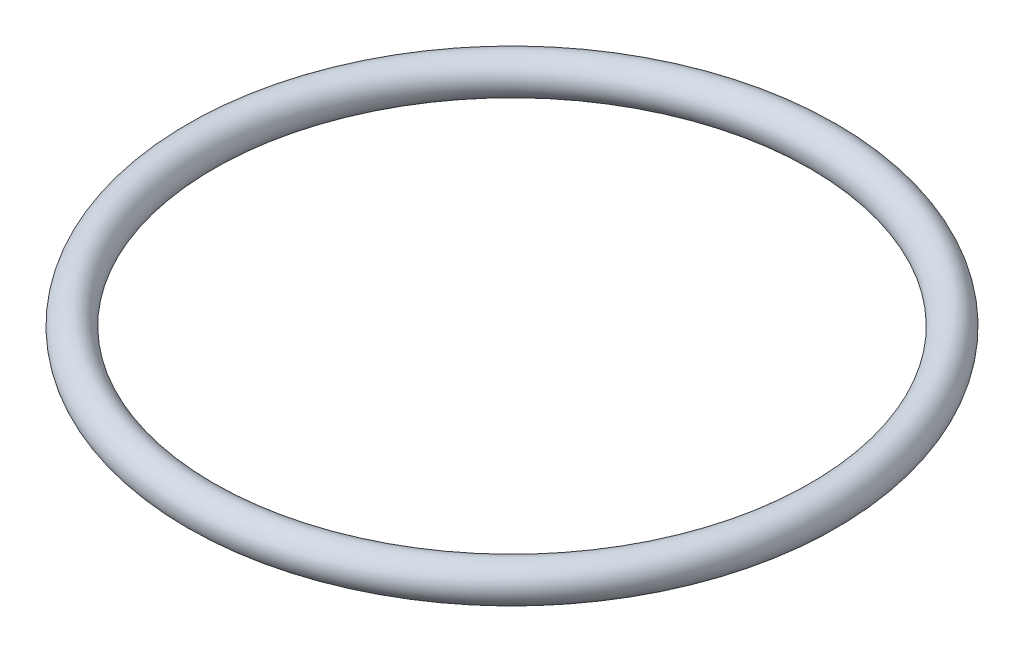
ISO-10303-21;
HEADER;
FILE_DESCRIPTION(('STEP AP214'),'2;1');
FILE_NAME('part.step','',(''),(''),'','','');
FILE_SCHEMA(('AUTOMOTIVE_DESIGN { 1 0 10303 214 1 1 1 1 }'));
ENDSEC;
DATA;
#1=APPLICATION_CONTEXT('core data for automotive mechanical design processes');
#2=APPLICATION_PROTOCOL_DEFINITION('international standard','automotive_design',2000,#1);
#3=PRODUCT_CONTEXT('',#1,'mechanical');
#4=PRODUCT('Part','Part','',(#3));
#5=PRODUCT_RELATED_PRODUCT_CATEGORY('part','',(#4));
#6=PRODUCT_DEFINITION_FORMATION('','',#4);
#7=PRODUCT_DEFINITION_CONTEXT('part definition',#1,'design');
#8=PRODUCT_DEFINITION('design','',#6,#7);
#9=PRODUCT_DEFINITION_SHAPE('','',#8);
#10=(LENGTH_UNIT() NAMED_UNIT(*) SI_UNIT(.MILLI.,.METRE.));
#11=(NAMED_UNIT(*) PLANE_ANGLE_UNIT() SI_UNIT($,.RADIAN.));
#12=(NAMED_UNIT(*) SI_UNIT($,.STERADIAN.) SOLID_ANGLE_UNIT());
#13=UNCERTAINTY_MEASURE_WITH_UNIT(LENGTH_MEASURE(1.E-05),#10,'distance_accuracy_value','');
#14=(GEOMETRIC_REPRESENTATION_CONTEXT(3) GLOBAL_UNCERTAINTY_ASSIGNED_CONTEXT((#13)) GLOBAL_UNIT_ASSIGNED_CONTEXT((#10,
#11,#12)) REPRESENTATION_CONTEXT('',''));
#15=CARTESIAN_POINT('',(0.,0.,0.));
#16=DIRECTION('',(0.,0.,1.));
#17=DIRECTION('',(1.,0.,0.));
#18=AXIS2_PLACEMENT_3D('',#15,#16,#17);
#19=CARTESIAN_POINT('',(0.,-1.38996771953505,0.));
#20=DIRECTION('',(0.,1.,0.));
#21=DIRECTION('',(0.,0.,1.));
#22=AXIS2_PLACEMENT_3D('',#19,#20,#21);
#23=TOROIDAL_SURFACE('',#22,25.5,1.5);
#24=CARTESIAN_POINT('',(0.,-1.38996771953505,27.));
#25=VERTEX_POINT('',#24);
#26=VERTEX_LOOP('',#25);
#27=FACE_BOUND('',#26,.T.);
#28=ADVANCED_FACE('F36',(#27),#23,.T.);
#29=CLOSED_SHELL('',(#28));
#30=MANIFOLD_SOLID_BREP('B2',#29);
#31=ADVANCED_BREP_SHAPE_REPRESENTATION('',(#18,#30),#14);
#32=SHAPE_DEFINITION_REPRESENTATION(#9,#31);
ENDSEC;
END-ISO-10303-21;
